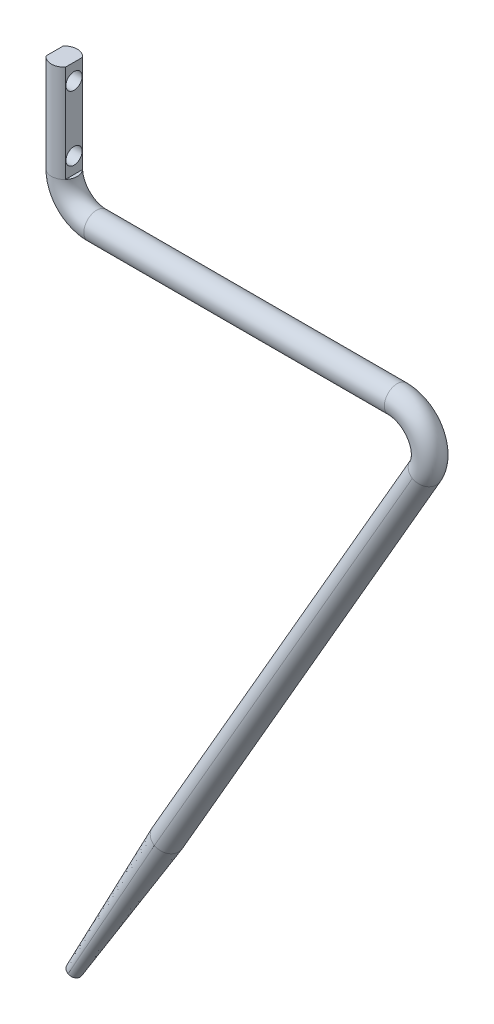
ISO-10303-21;
HEADER;
FILE_DESCRIPTION(('STEP AP214'),'2;1');
FILE_NAME('part.step','',(''),(''),'','','');
FILE_SCHEMA(('AUTOMOTIVE_DESIGN { 1 0 10303 214 1 1 1 1 }'));
ENDSEC;
DATA;
#1=APPLICATION_CONTEXT('core data for automotive mechanical design processes');
#2=APPLICATION_PROTOCOL_DEFINITION('international standard','automotive_design',2000,#1);
#3=PRODUCT_CONTEXT('',#1,'mechanical');
#4=PRODUCT('Part','Part','',(#3));
#5=PRODUCT_RELATED_PRODUCT_CATEGORY('part','',(#4));
#6=PRODUCT_DEFINITION_FORMATION('','',#4);
#7=PRODUCT_DEFINITION_CONTEXT('part definition',#1,'design');
#8=PRODUCT_DEFINITION('design','',#6,#7);
#9=PRODUCT_DEFINITION_SHAPE('','',#8);
#10=(LENGTH_UNIT() NAMED_UNIT(*) SI_UNIT(.MILLI.,.METRE.));
#11=(NAMED_UNIT(*) PLANE_ANGLE_UNIT() SI_UNIT($,.RADIAN.));
#12=(NAMED_UNIT(*) SI_UNIT($,.STERADIAN.) SOLID_ANGLE_UNIT());
#13=UNCERTAINTY_MEASURE_WITH_UNIT(LENGTH_MEASURE(1.E-05),#10,'distance_accuracy_value','');
#14=(GEOMETRIC_REPRESENTATION_CONTEXT(3) GLOBAL_UNCERTAINTY_ASSIGNED_CONTEXT((#13)) GLOBAL_UNIT_ASSIGNED_CONTEXT((#10,
#11,#12)) REPRESENTATION_CONTEXT('',''));
#15=CARTESIAN_POINT('',(0.,0.,0.));
#16=DIRECTION('',(0.,0.,1.));
#17=DIRECTION('',(1.,0.,0.));
#18=AXIS2_PLACEMENT_3D('',#15,#16,#17);
#19=CARTESIAN_POINT('',(31.78520666086,-152.799950122738,0.));
#20=DIRECTION('',(0.499981725575931,0.866035954271019,0.));
#21=DIRECTION('',(-0.866035954271019,0.499981725575931,0.));
#22=AXIS2_PLACEMENT_3D('',#19,#20,#21);
#23=CONICAL_SURFACE('',#22,4.,0.0349065850398885);
#24=CARTESIAN_POINT('',(31.78520666086,-152.799950122738,0.));
#25=DIRECTION('',(0.499981725575931,0.866035954271019,0.));
#26=DIRECTION('',(-0.866035954271019,0.499981725575931,0.));
#27=AXIS2_PLACEMENT_3D('',#24,#25,#26);
#28=CIRCLE('',#27,4.);
#29=CARTESIAN_POINT('',(31.78520666086,-152.799950122738,-4.));
#30=VERTEX_POINT('',#29);
#31=CARTESIAN_POINT('',(31.78520666086,-152.799950122738,4.));
#32=VERTEX_POINT('',#31);
#33=EDGE_CURVE('E251',#30,#32,#28,.T.);
#34=ORIENTED_EDGE('',*,*,#33,.F.);
#35=DIRECTION('',(0.499677150217765,0.865508388567185,-0.0348994967025029));
#36=VECTOR('',#35,1.);
#37=CARTESIAN_POINT('',(-25.4852066608231,-252.000049877198,0.));
#38=LINE('',#37,#36);
#39=CARTESIAN_POINT('',(3.15,-202.4,-1.99999999999871));
#40=VERTEX_POINT('',#39);
#41=EDGE_CURVE('E12',#30,#40,#38,.F.);
#42=ORIENTED_EDGE('',*,*,#41,.T.);
#43=CARTESIAN_POINT('',(3.15,-202.4,0.));
#44=DIRECTION('',(0.499981725575932,0.866035954271019,0.));
#45=DIRECTION('',(-0.866035954271019,0.499981725575932,0.));
#46=AXIS2_PLACEMENT_3D('',#43,#44,#45);
#47=CIRCLE('',#46,1.99999999999871);
#48=CARTESIAN_POINT('',(3.15,-202.4,1.99999999999871));
#49=VERTEX_POINT('',#48);
#50=EDGE_CURVE('E255',#49,#40,#47,.F.);
#51=ORIENTED_EDGE('',*,*,#50,.F.);
#52=DIRECTION('',(-0.499677150217765,-0.865508388567185,-0.0348994967025029));
#53=VECTOR('',#52,1.);
#54=CARTESIAN_POINT('',(-25.4852066608231,-252.000049877198,0.));
#55=LINE('',#54,#53);
#56=EDGE_CURVE('E51',#49,#32,#55,.F.);
#57=ORIENTED_EDGE('',*,*,#56,.T.);
#58=EDGE_LOOP('',(#34,#42,#51,#57));
#59=FACE_BOUND('',#58,.T.);
#60=ADVANCED_FACE('F47',(#59),#23,.T.);
#61=CARTESIAN_POINT('',(111.340273486485,-14.9998172557593,0.));
#62=DIRECTION('',(-0.499981725575931,-0.866035954271019,0.));
#63=DIRECTION('',(0.866035954271019,-0.499981725575931,0.));
#64=AXIS2_PLACEMENT_3D('',#61,#62,#63);
#65=CYLINDRICAL_SURFACE('',#64,4.);
#66=DIRECTION('',(-0.499981725575931,-0.866035954271019,0.));
#67=VECTOR('',#66,1.);
#68=CARTESIAN_POINT('',(111.340273486485,-14.9998172557593,4.));
#69=LINE('',#68,#67);
#70=CARTESIAN_POINT('',(111.340273486485,-14.9998172557593,4.));
#71=VERTEX_POINT('',#70);
#72=EDGE_CURVE('E261',#71,#32,#69,.T.);
#73=ORIENTED_EDGE('',*,*,#72,.F.);
#74=CARTESIAN_POINT('',(111.340273486485,-14.9998172557593,0.));
#75=DIRECTION('',(0.49998172557593,0.866035954271019,0.));
#76=DIRECTION('',(0.,0.,1.));
#77=AXIS2_PLACEMENT_3D('',#74,#75,#76);
#78=CIRCLE('',#77,4.);
#79=CARTESIAN_POINT('',(111.340273486485,-14.9998172557593,-4.));
#80=VERTEX_POINT('',#79);
#81=EDGE_CURVE('E244',#80,#71,#78,.T.);
#82=ORIENTED_EDGE('',*,*,#81,.F.);
#83=DIRECTION('',(-0.499981725575931,-0.866035954271019,0.));
#84=VECTOR('',#83,1.);
#85=CARTESIAN_POINT('',(111.340273486485,-14.9998172557593,-4.));
#86=LINE('',#85,#84);
#87=EDGE_CURVE('E258',#30,#80,#86,.F.);
#88=ORIENTED_EDGE('',*,*,#87,.F.);
#89=ORIENTED_EDGE('',*,*,#33,.T.);
#90=EDGE_LOOP('',(#73,#82,#88,#89));
#91=FACE_BOUND('',#90,.T.);
#92=ADVANCED_FACE('F187',(#91),#65,.T.);
#93=CARTESIAN_POINT('',(0.,40.,0.));
#94=DIRECTION('',(0.,1.,0.));
#95=DIRECTION('',(0.,0.,1.));
#96=AXIS2_PLACEMENT_3D('',#93,#94,#95);
#97=PLANE('',#96);
#98=CARTESIAN_POINT('',(0.,40.,0.));
#99=DIRECTION('',(0.,1.,0.));
#100=DIRECTION('',(0.,0.,1.));
#101=AXIS2_PLACEMENT_3D('',#98,#99,#100);
#102=CIRCLE('',#101,4.);
#103=CARTESIAN_POINT('',(3.,40.,-2.64575131106459));
#104=VERTEX_POINT('',#103);
#105=CARTESIAN_POINT('',(-3.,40.,-2.64575131106459));
#106=VERTEX_POINT('',#105);
#107=EDGE_CURVE('E137',#104,#106,#102,.T.);
#108=ORIENTED_EDGE('',*,*,#107,.T.);
#109=DIRECTION('',(0.,0.,1.));
#110=VECTOR('',#109,1.);
#111=CARTESIAN_POINT('',(-3.,40.,-17.7651075584702));
#112=LINE('',#111,#110);
#113=CARTESIAN_POINT('',(-3.,40.,2.64575131106459));
#114=VERTEX_POINT('',#113);
#115=EDGE_CURVE('E121',#106,#114,#112,.T.);
#116=ORIENTED_EDGE('',*,*,#115,.T.);
#117=CARTESIAN_POINT('',(0.,40.,4.));
#118=VERTEX_POINT('',#117);
#119=EDGE_CURVE('E136',#114,#118,#102,.T.);
#120=ORIENTED_EDGE('',*,*,#119,.T.);
#121=CARTESIAN_POINT('',(3.,40.,2.64575131106458));
#122=VERTEX_POINT('',#121);
#123=EDGE_CURVE('E128',#118,#122,#102,.T.);
#124=ORIENTED_EDGE('',*,*,#123,.T.);
#125=DIRECTION('',(0.,0.,-1.));
#126=VECTOR('',#125,1.);
#127=CARTESIAN_POINT('',(3.,40.,-17.7651075584702));
#128=LINE('',#127,#126);
#129=EDGE_CURVE('E108',#122,#104,#128,.T.);
#130=ORIENTED_EDGE('',*,*,#129,.T.);
#131=EDGE_LOOP('',(#108,#116,#120,#124,#130));
#132=FACE_BOUND('',#131,.T.);
#133=ADVANCED_FACE('F134',(#132),#97,.T.);
#134=CARTESIAN_POINT('',(0.,40.,0.));
#135=DIRECTION('',(0.,-1.,0.));
#136=DIRECTION('',(0.,0.,-1.));
#137=AXIS2_PLACEMENT_3D('',#134,#135,#136);
#138=CYLINDRICAL_SURFACE('',#137,4.);
#139=DIRECTION('',(0.,-1.,0.));
#140=VECTOR('',#139,1.);
#141=CARTESIAN_POINT('',(-3.,40.,-2.64575131106459));
#142=LINE('',#141,#140);
#143=CARTESIAN_POINT('',(-3.,10.0000000000001,-2.64575131106459));
#144=VERTEX_POINT('',#143);
#145=EDGE_CURVE('E143',#106,#144,#142,.T.);
#146=ORIENTED_EDGE('',*,*,#145,.F.);
#147=ORIENTED_EDGE('',*,*,#107,.F.);
#148=DIRECTION('',(0.,-1.,0.));
#149=VECTOR('',#148,1.);
#150=CARTESIAN_POINT('',(3.,40.,-2.64575131106459));
#151=LINE('',#150,#149);
#152=CARTESIAN_POINT('',(3.,10.,-2.64575131106427));
#153=VERTEX_POINT('',#152);
#154=EDGE_CURVE('E115',#153,#104,#151,.F.);
#155=ORIENTED_EDGE('',*,*,#154,.F.);
#156=CARTESIAN_POINT('',(0.,10.0000000000001,0.));
#157=DIRECTION('',(0.,1.,0.));
#158=DIRECTION('',(0.,0.,1.));
#159=AXIS2_PLACEMENT_3D('',#156,#157,#158);
#160=CIRCLE('',#159,4.);
#161=EDGE_CURVE('E276',#153,#144,#160,.T.);
#162=ORIENTED_EDGE('',*,*,#161,.T.);
#163=EDGE_LOOP('',(#146,#147,#155,#162));
#164=FACE_BOUND('',#163,.T.);
#165=ADVANCED_FACE('F217',(#164),#138,.T.);
#166=DIRECTION('',(0.,-1.,0.));
#167=VECTOR('',#166,1.);
#168=CARTESIAN_POINT('',(-3.,40.,2.64575131106459));
#169=LINE('',#168,#167);
#170=CARTESIAN_POINT('',(-3.,10.,2.64575131106491));
#171=VERTEX_POINT('',#170);
#172=EDGE_CURVE('E132',#171,#114,#169,.F.);
#173=ORIENTED_EDGE('',*,*,#172,.F.);
#174=CARTESIAN_POINT('',(3.,10.0000000000001,2.64575131106459));
#175=VERTEX_POINT('',#174);
#176=EDGE_CURVE('E130',#171,#175,#160,.T.);
#177=ORIENTED_EDGE('',*,*,#176,.T.);
#178=DIRECTION('',(0.,-1.,0.));
#179=VECTOR('',#178,1.);
#180=CARTESIAN_POINT('',(3.,40.,2.64575131106459));
#181=LINE('',#180,#179);
#182=EDGE_CURVE('E112',#122,#175,#181,.T.);
#183=ORIENTED_EDGE('',*,*,#182,.F.);
#184=ORIENTED_EDGE('',*,*,#123,.F.);
#185=ORIENTED_EDGE('',*,*,#119,.F.);
#186=EDGE_LOOP('',(#173,#177,#183,#184,#185));
#187=FACE_BOUND('',#186,.T.);
#188=ADVANCED_FACE('F126',(#187),#138,.T.);
#189=CARTESIAN_POINT('',(3.15,-202.4,0.));
#190=DIRECTION('',(0.499981725575932,0.866035954271019,0.));
#191=DIRECTION('',(0.,0.,1.));
#192=AXIS2_PLACEMENT_3D('',#189,#190,#191);
#193=PLANE('',#192);
#194=EDGE_CURVE('E256',#40,#49,#47,.F.);
#195=ORIENTED_EDGE('',*,*,#194,.T.);
#196=ORIENTED_EDGE('',*,*,#50,.T.);
#197=EDGE_LOOP('',(#195,#196));
#198=FACE_BOUND('',#197,.T.);
#199=ADVANCED_FACE('F196',(#198),#193,.F.);
#200=CARTESIAN_POINT('',(10.,10.,0.));
#201=DIRECTION('',(0.,0.,1.));
#202=DIRECTION('',(1.,0.,0.));
#203=AXIS2_PLACEMENT_3D('',#200,#201,#202);
#204=TOROIDAL_SURFACE('',#203,10.0000000000003,4.);
#205=CARTESIAN_POINT('',(10.0000000000001,0.,0.));
#206=DIRECTION('',(-1.,0.,0.));
#207=DIRECTION('',(0.,0.,1.));
#208=AXIS2_PLACEMENT_3D('',#205,#206,#207);
#209=CIRCLE('',#208,4.);
#210=CARTESIAN_POINT('',(10.0000000000001,0.,4.));
#211=VERTEX_POINT('',#210);
#212=EDGE_CURVE('E245',#211,#211,#209,.T.);
#213=ORIENTED_EDGE('',*,*,#212,.T.);
#214=EDGE_LOOP('',(#213));
#215=FACE_BOUND('',#214,.T.);
#216=EDGE_CURVE('E141',#175,#153,#160,.T.);
#217=ORIENTED_EDGE('',*,*,#216,.F.);
#218=ORIENTED_EDGE('',*,*,#176,.F.);
#219=EDGE_CURVE('E139',#144,#171,#160,.T.);
#220=ORIENTED_EDGE('',*,*,#219,.F.);
#221=ORIENTED_EDGE('',*,*,#161,.F.);
#222=EDGE_LOOP('',(#217,#218,#220,#221));
#223=FACE_BOUND('',#222,.T.);
#224=ADVANCED_FACE('F207',(#215,#223),#204,.T.);
#225=CARTESIAN_POINT('',(10.0000000000001,0.,0.));
#226=DIRECTION('',(1.,0.,0.));
#227=DIRECTION('',(0.,0.,-1.));
#228=AXIS2_PLACEMENT_3D('',#225,#226,#227);
#229=CYLINDRICAL_SURFACE('',#228,4.);
#230=CARTESIAN_POINT('',(102.679913943775,0.,0.));
#231=DIRECTION('',(-1.,0.,0.));
#232=DIRECTION('',(0.,0.,1.));
#233=AXIS2_PLACEMENT_3D('',#230,#231,#232);
#234=CIRCLE('',#233,4.);
#235=CARTESIAN_POINT('',(102.679913943775,0.,4.));
#236=VERTEX_POINT('',#235);
#237=EDGE_CURVE('E243',#236,#236,#234,.T.);
#238=ORIENTED_EDGE('',*,*,#237,.T.);
#239=EDGE_LOOP('',(#238));
#240=FACE_BOUND('',#239,.T.);
#241=ORIENTED_EDGE('',*,*,#212,.F.);
#242=EDGE_LOOP('',(#241));
#243=FACE_BOUND('',#242,.T.);
#244=ADVANCED_FACE('F214',(#240,#243),#229,.T.);
#245=CARTESIAN_POINT('',(102.679913943775,-10.,0.));
#246=DIRECTION('',(0.,0.,-1.));
#247=DIRECTION('',(-1.,0.,0.));
#248=AXIS2_PLACEMENT_3D('',#245,#246,#247);
#249=TOROIDAL_SURFACE('',#248,10.,4.);
#250=EDGE_CURVE('E240',#71,#80,#78,.T.);
#251=ORIENTED_EDGE('',*,*,#250,.T.);
#252=ORIENTED_EDGE('',*,*,#81,.T.);
#253=EDGE_LOOP('',(#251,#252));
#254=FACE_BOUND('',#253,.T.);
#255=ORIENTED_EDGE('',*,*,#237,.F.);
#256=EDGE_LOOP('',(#255));
#257=FACE_BOUND('',#256,.T.);
#258=ADVANCED_FACE('F204',(#254,#257),#249,.T.);
#259=ORIENTED_EDGE('',*,*,#250,.F.);
#260=ORIENTED_EDGE('',*,*,#72,.T.);
#261=EDGE_CURVE('E252',#32,#30,#28,.T.);
#262=ORIENTED_EDGE('',*,*,#261,.T.);
#263=ORIENTED_EDGE('',*,*,#87,.T.);
#264=EDGE_LOOP('',(#259,#260,#262,#263));
#265=FACE_BOUND('',#264,.T.);
#266=ADVANCED_FACE('F193',(#265),#65,.T.);
#267=ORIENTED_EDGE('',*,*,#41,.F.);
#268=ORIENTED_EDGE('',*,*,#261,.F.);
#269=ORIENTED_EDGE('',*,*,#56,.F.);
#270=ORIENTED_EDGE('',*,*,#194,.F.);
#271=EDGE_LOOP('',(#267,#268,#269,#270));
#272=FACE_BOUND('',#271,.T.);
#273=ADVANCED_FACE('F49',(#272),#23,.T.);
#274=CARTESIAN_POINT('',(56.3399569718873,10.,0.));
#275=DIRECTION('',(0.,1.,0.));
#276=DIRECTION('',(0.,0.,1.));
#277=AXIS2_PLACEMENT_3D('',#274,#275,#276);
#278=PLANE('',#277);
#279=ORIENTED_EDGE('',*,*,#219,.T.);
#280=DIRECTION('',(0.,0.,1.));
#281=VECTOR('',#280,1.);
#282=CARTESIAN_POINT('',(-3.,10.,-17.7651075584702));
#283=LINE('',#282,#281);
#284=EDGE_CURVE('E120',#144,#171,#283,.T.);
#285=ORIENTED_EDGE('',*,*,#284,.F.);
#286=EDGE_LOOP('',(#279,#285));
#287=FACE_BOUND('',#286,.T.);
#288=ADVANCED_FACE('F195',(#287),#278,.T.);
#289=CARTESIAN_POINT('',(-3.,10.,-17.7651075584702));
#290=DIRECTION('',(-1.,0.,0.));
#291=DIRECTION('',(0.,0.,1.));
#292=AXIS2_PLACEMENT_3D('',#289,#290,#291);
#293=PLANE('',#292);
#294=CARTESIAN_POINT('',(-3.,35.0000000000001,0.));
#295=DIRECTION('',(-1.,0.,0.));
#296=DIRECTION('',(0.,0.,1.));
#297=AXIS2_PLACEMENT_3D('',#294,#295,#296);
#298=CIRCLE('',#297,2.49999999999999);
#299=CARTESIAN_POINT('',(-3.,35.0000000000001,2.49999999999999));
#300=VERTEX_POINT('',#299);
#301=EDGE_CURVE('E162',#300,#300,#298,.T.);
#302=ORIENTED_EDGE('',*,*,#301,.F.);
#303=EDGE_LOOP('',(#302));
#304=FACE_BOUND('',#303,.T.);
#305=CARTESIAN_POINT('',(-3.,15.0000000000001,0.));
#306=DIRECTION('',(-1.,0.,0.));
#307=DIRECTION('',(0.,0.,1.));
#308=AXIS2_PLACEMENT_3D('',#305,#306,#307);
#309=CIRCLE('',#308,2.49999999999999);
#310=CARTESIAN_POINT('',(-3.,15.0000000000001,2.49999999999999));
#311=VERTEX_POINT('',#310);
#312=EDGE_CURVE('E154',#311,#311,#309,.T.);
#313=ORIENTED_EDGE('',*,*,#312,.F.);
#314=EDGE_LOOP('',(#313));
#315=FACE_BOUND('',#314,.T.);
#316=ORIENTED_EDGE('',*,*,#145,.T.);
#317=ORIENTED_EDGE('',*,*,#284,.T.);
#318=ORIENTED_EDGE('',*,*,#172,.T.);
#319=ORIENTED_EDGE('',*,*,#115,.F.);
#320=EDGE_LOOP('',(#316,#317,#318,#319));
#321=FACE_BOUND('',#320,.T.);
#322=ADVANCED_FACE('F201',(#304,#315,#321),#293,.T.);
#323=ORIENTED_EDGE('',*,*,#216,.T.);
#324=DIRECTION('',(0.,0.,-1.));
#325=VECTOR('',#324,1.);
#326=CARTESIAN_POINT('',(3.,10.,-17.7651075584702));
#327=LINE('',#326,#325);
#328=EDGE_CURVE('E151',#175,#153,#327,.T.);
#329=ORIENTED_EDGE('',*,*,#328,.F.);
#330=EDGE_LOOP('',(#323,#329));
#331=FACE_BOUND('',#330,.T.);
#332=ADVANCED_FACE('F174',(#331),#278,.T.);
#333=CARTESIAN_POINT('',(3.,10.,-17.7651075584702));
#334=DIRECTION('',(1.,0.,0.));
#335=DIRECTION('',(0.,0.,-1.));
#336=AXIS2_PLACEMENT_3D('',#333,#334,#335);
#337=PLANE('',#336);
#338=CARTESIAN_POINT('',(3.,35.0000000000001,0.));
#339=DIRECTION('',(1.,0.,0.));
#340=DIRECTION('',(0.,0.,-1.));
#341=AXIS2_PLACEMENT_3D('',#338,#339,#340);
#342=CIRCLE('',#341,2.49999999999999);
#343=CARTESIAN_POINT('',(3.,35.0000000000001,-2.49999999999999));
#344=VERTEX_POINT('',#343);
#345=EDGE_CURVE('E165',#344,#344,#342,.T.);
#346=ORIENTED_EDGE('',*,*,#345,.F.);
#347=EDGE_LOOP('',(#346));
#348=FACE_BOUND('',#347,.T.);
#349=CARTESIAN_POINT('',(3.,15.0000000000001,0.));
#350=DIRECTION('',(1.,0.,0.));
#351=DIRECTION('',(0.,0.,-1.));
#352=AXIS2_PLACEMENT_3D('',#349,#350,#351);
#353=CIRCLE('',#352,2.49999999999999);
#354=CARTESIAN_POINT('',(3.,15.0000000000001,-2.49999999999999));
#355=VERTEX_POINT('',#354);
#356=EDGE_CURVE('E159',#355,#355,#353,.T.);
#357=ORIENTED_EDGE('',*,*,#356,.F.);
#358=EDGE_LOOP('',(#357));
#359=FACE_BOUND('',#358,.T.);
#360=ORIENTED_EDGE('',*,*,#182,.T.);
#361=ORIENTED_EDGE('',*,*,#328,.T.);
#362=ORIENTED_EDGE('',*,*,#154,.T.);
#363=ORIENTED_EDGE('',*,*,#129,.F.);
#364=EDGE_LOOP('',(#360,#361,#362,#363));
#365=FACE_BOUND('',#364,.T.);
#366=ADVANCED_FACE('F110',(#348,#359,#365),#337,.T.);
#367=CARTESIAN_POINT('',(3.,15.0000000000001,0.));
#368=DIRECTION('',(1.,0.,0.));
#369=DIRECTION('',(0.,0.,-1.));
#370=AXIS2_PLACEMENT_3D('',#367,#368,#369);
#371=CYLINDRICAL_SURFACE('',#370,2.49999999999999);
#372=ORIENTED_EDGE('',*,*,#312,.T.);
#373=EDGE_LOOP('',(#372));
#374=FACE_BOUND('',#373,.T.);
#375=ORIENTED_EDGE('',*,*,#356,.T.);
#376=EDGE_LOOP('',(#375));
#377=FACE_BOUND('',#376,.T.);
#378=ADVANCED_FACE('F173',(#374,#377),#371,.F.);
#379=CARTESIAN_POINT('',(3.,35.0000000000001,0.));
#380=DIRECTION('',(1.,0.,0.));
#381=DIRECTION('',(0.,0.,-1.));
#382=AXIS2_PLACEMENT_3D('',#379,#380,#381);
#383=CYLINDRICAL_SURFACE('',#382,2.49999999999999);
#384=ORIENTED_EDGE('',*,*,#301,.T.);
#385=EDGE_LOOP('',(#384));
#386=FACE_BOUND('',#385,.T.);
#387=ORIENTED_EDGE('',*,*,#345,.T.);
#388=EDGE_LOOP('',(#387));
#389=FACE_BOUND('',#388,.T.);
#390=ADVANCED_FACE('F169',(#386,#389),#383,.F.);
#391=CLOSED_SHELL('',(#60,#92,#133,#165,#188,#199,#224,#244,#258,#266,#273,#288,#322,#332,#366,
#378,#390));
#392=MANIFOLD_SOLID_BREP('B2',#391);
#393=ADVANCED_BREP_SHAPE_REPRESENTATION('',(#18,#392),#14);
#394=SHAPE_DEFINITION_REPRESENTATION(#9,#393);
ENDSEC;
END-ISO-10303-21;
